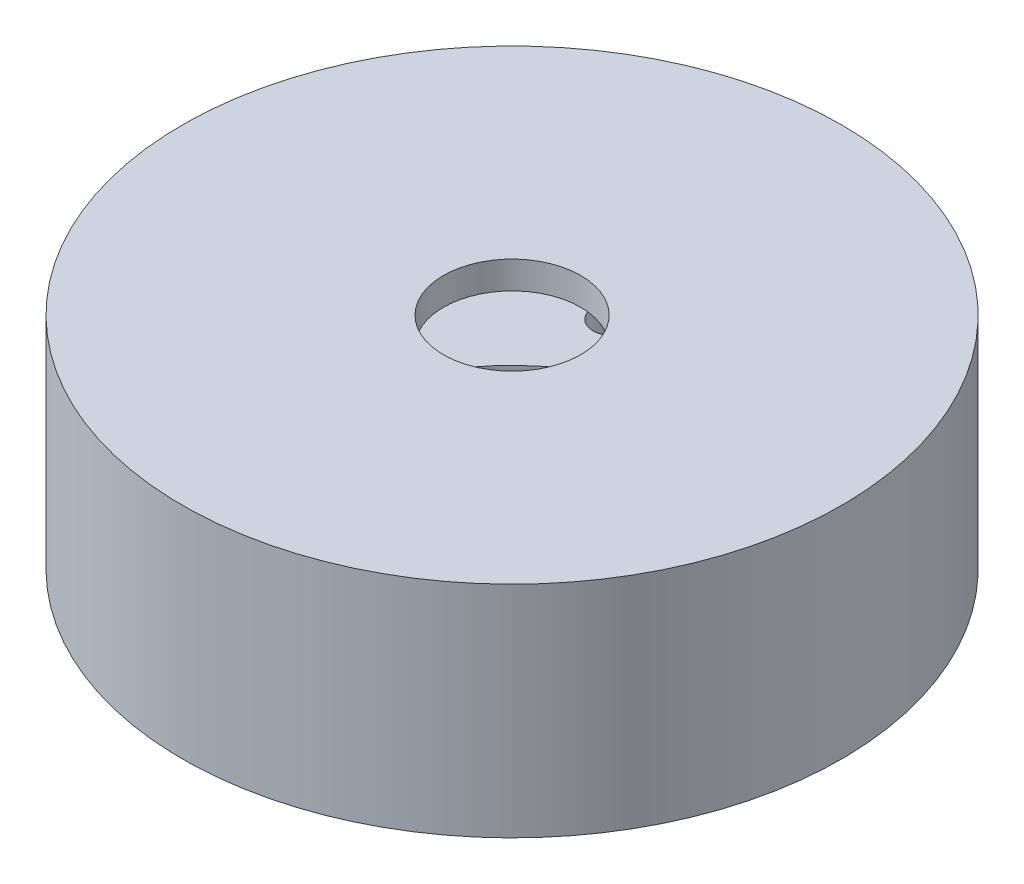
ISO-10303-21;
HEADER;
FILE_DESCRIPTION(('STEP AP214'),'2;1');
FILE_NAME('part.step','',(''),(''),'','','');
FILE_SCHEMA(('AUTOMOTIVE_DESIGN { 1 0 10303 214 1 1 1 1 }'));
ENDSEC;
DATA;
#1=APPLICATION_CONTEXT('core data for automotive mechanical design processes');
#2=APPLICATION_PROTOCOL_DEFINITION('international standard','automotive_design',2000,#1);
#3=PRODUCT_CONTEXT('',#1,'mechanical');
#4=PRODUCT('Part','Part','',(#3));
#5=PRODUCT_RELATED_PRODUCT_CATEGORY('part','',(#4));
#6=PRODUCT_DEFINITION_FORMATION('','',#4);
#7=PRODUCT_DEFINITION_CONTEXT('part definition',#1,'design');
#8=PRODUCT_DEFINITION('design','',#6,#7);
#9=PRODUCT_DEFINITION_SHAPE('','',#8);
#10=(LENGTH_UNIT() NAMED_UNIT(*) SI_UNIT(.MILLI.,.METRE.));
#11=(NAMED_UNIT(*) PLANE_ANGLE_UNIT() SI_UNIT($,.RADIAN.));
#12=(NAMED_UNIT(*) SI_UNIT($,.STERADIAN.) SOLID_ANGLE_UNIT());
#13=UNCERTAINTY_MEASURE_WITH_UNIT(LENGTH_MEASURE(1.E-05),#10,'distance_accuracy_value','');
#14=(GEOMETRIC_REPRESENTATION_CONTEXT(3) GLOBAL_UNCERTAINTY_ASSIGNED_CONTEXT((#13)) GLOBAL_UNIT_ASSIGNED_CONTEXT((#10,
#11,#12)) REPRESENTATION_CONTEXT('',''));
#15=CARTESIAN_POINT('',(0.,0.,0.));
#16=DIRECTION('',(0.,0.,1.));
#17=DIRECTION('',(1.,0.,0.));
#18=AXIS2_PLACEMENT_3D('',#15,#16,#17);
#19=CARTESIAN_POINT('',(-139.7,12.7,0.));
#20=DIRECTION('',(0.,1.,0.));
#21=DIRECTION('',(0.,0.,1.));
#22=AXIS2_PLACEMENT_3D('',#19,#20,#21);
#23=PLANE('',#22);
#24=CARTESIAN_POINT('',(0.,12.7,0.));
#25=DIRECTION('',(0.,-1.,0.));
#26=DIRECTION('',(0.,0.,-1.));
#27=AXIS2_PLACEMENT_3D('',#24,#25,#26);
#28=CIRCLE('',#27,139.7);
#29=CARTESIAN_POINT('',(0.,12.7,-139.7));
#30=VERTEX_POINT('',#29);
#31=EDGE_CURVE('E36',#30,#30,#28,.T.);
#32=ORIENTED_EDGE('',*,*,#31,.F.);
#33=EDGE_LOOP('',(#32));
#34=FACE_BOUND('',#33,.T.);
#35=CARTESIAN_POINT('',(127.67505097969,12.7,0.));
#36=DIRECTION('',(0.,1.,0.));
#37=DIRECTION('',(0.,0.,1.));
#38=AXIS2_PLACEMENT_3D('',#35,#36,#37);
#39=CIRCLE('',#38,9.26720301595461);
#40=CARTESIAN_POINT('',(127.67505097969,12.7,9.26720301595461));
#41=VERTEX_POINT('',#40);
#42=EDGE_CURVE('E60',#41,#41,#39,.F.);
#43=ORIENTED_EDGE('',*,*,#42,.T.);
#44=EDGE_LOOP('',(#43));
#45=FACE_BOUND('',#44,.T.);
#46=CARTESIAN_POINT('',(63.8375254898446,12.7,-110.569837577885));
#47=DIRECTION('',(0.,1.,0.));
#48=DIRECTION('',(0.,0.,1.));
#49=AXIS2_PLACEMENT_3D('',#46,#47,#48);
#50=CIRCLE('',#49,9.26720301595461);
#51=CARTESIAN_POINT('',(63.8375254898446,12.7,-101.30263456193));
#52=VERTEX_POINT('',#51);
#53=EDGE_CURVE('E90',#52,#52,#50,.F.);
#54=ORIENTED_EDGE('',*,*,#53,.T.);
#55=EDGE_LOOP('',(#54));
#56=FACE_BOUND('',#55,.T.);
#57=CARTESIAN_POINT('',(-63.8375254898454,12.7,-110.569837577884));
#58=DIRECTION('',(0.,1.,0.));
#59=DIRECTION('',(0.,0.,1.));
#60=AXIS2_PLACEMENT_3D('',#57,#58,#59);
#61=CIRCLE('',#60,9.26720301595462);
#62=CARTESIAN_POINT('',(-63.8375254898454,12.7,-101.30263456193));
#63=VERTEX_POINT('',#62);
#64=EDGE_CURVE('E84',#63,#63,#61,.F.);
#65=ORIENTED_EDGE('',*,*,#64,.T.);
#66=EDGE_LOOP('',(#65));
#67=FACE_BOUND('',#66,.T.);
#68=CARTESIAN_POINT('',(-127.67505097969,12.7,8.91550115862865E-13));
#69=DIRECTION('',(0.,1.,0.));
#70=DIRECTION('',(0.,0.,1.));
#71=AXIS2_PLACEMENT_3D('',#68,#69,#70);
#72=CIRCLE('',#71,9.26720301595462);
#73=CARTESIAN_POINT('',(-127.67505097969,12.7,9.26720301595551));
#74=VERTEX_POINT('',#73);
#75=EDGE_CURVE('E78',#74,#74,#72,.F.);
#76=ORIENTED_EDGE('',*,*,#75,.T.);
#77=EDGE_LOOP('',(#76));
#78=FACE_BOUND('',#77,.T.);
#79=CARTESIAN_POINT('',(-63.8375254898439,12.7,110.569837577885));
#80=DIRECTION('',(0.,1.,0.));
#81=DIRECTION('',(0.,0.,1.));
#82=AXIS2_PLACEMENT_3D('',#79,#80,#81);
#83=CIRCLE('',#82,9.26720301595461);
#84=CARTESIAN_POINT('',(-63.8375254898439,12.7,119.83704059384));
#85=VERTEX_POINT('',#84);
#86=EDGE_CURVE('E72',#85,#85,#83,.F.);
#87=ORIENTED_EDGE('',*,*,#86,.T.);
#88=EDGE_LOOP('',(#87));
#89=FACE_BOUND('',#88,.T.);
#90=CARTESIAN_POINT('',(63.8375254898462,12.7,110.569837577884));
#91=DIRECTION('',(0.,1.,0.));
#92=DIRECTION('',(0.,0.,1.));
#93=AXIS2_PLACEMENT_3D('',#90,#91,#92);
#94=CIRCLE('',#93,9.26720301595461);
#95=CARTESIAN_POINT('',(63.8375254898462,12.7,119.837040593839));
#96=VERTEX_POINT('',#95);
#97=EDGE_CURVE('E66',#96,#96,#94,.F.);
#98=ORIENTED_EDGE('',*,*,#97,.T.);
#99=EDGE_LOOP('',(#98));
#100=FACE_BOUND('',#99,.T.);
#101=CARTESIAN_POINT('',(0.,12.7,0.));
#102=DIRECTION('',(0.,1.,0.));
#103=DIRECTION('',(0.,0.,1.));
#104=AXIS2_PLACEMENT_3D('',#101,#102,#103);
#105=CIRCLE('',#104,97.2481137465327);
#106=CARTESIAN_POINT('',(0.,12.7,97.2481137465327));
#107=VERTEX_POINT('',#106);
#108=EDGE_CURVE('E57',#107,#107,#105,.F.);
#109=ORIENTED_EDGE('',*,*,#108,.T.);
#110=EDGE_LOOP('',(#109));
#111=FACE_BOUND('',#110,.T.);
#112=ADVANCED_FACE('F33',(#34,#45,#56,#67,#78,#89,#100,#111),#23,.T.);
#113=CARTESIAN_POINT('',(0.,50.8,0.));
#114=DIRECTION('',(0.,-1.,0.));
#115=DIRECTION('',(0.,0.,-1.));
#116=AXIS2_PLACEMENT_3D('',#113,#114,#115);
#117=CYLINDRICAL_SURFACE('',#116,152.4);
#118=CARTESIAN_POINT('',(0.,101.6,0.));
#119=DIRECTION('',(0.,-1.,0.));
#120=DIRECTION('',(0.,0.,-1.));
#121=AXIS2_PLACEMENT_3D('',#118,#119,#120);
#122=CIRCLE('',#121,152.4);
#123=CARTESIAN_POINT('',(0.,101.6,-152.4));
#124=VERTEX_POINT('',#123);
#125=EDGE_CURVE('E48',#124,#124,#122,.T.);
#126=ORIENTED_EDGE('',*,*,#125,.T.);
#127=EDGE_LOOP('',(#126));
#128=FACE_BOUND('',#127,.T.);
#129=CARTESIAN_POINT('',(0.,0.,0.));
#130=DIRECTION('',(0.,-1.,0.));
#131=DIRECTION('',(0.,0.,-1.));
#132=AXIS2_PLACEMENT_3D('',#129,#130,#131);
#133=CIRCLE('',#132,152.4);
#134=CARTESIAN_POINT('',(0.,0.,-152.4));
#135=VERTEX_POINT('',#134);
#136=EDGE_CURVE('E43',#135,#135,#133,.T.);
#137=ORIENTED_EDGE('',*,*,#136,.F.);
#138=EDGE_LOOP('',(#137));
#139=FACE_BOUND('',#138,.T.);
#140=ADVANCED_FACE('F120',(#128,#139),#117,.T.);
#141=CARTESIAN_POINT('',(0.,101.6,0.));
#142=DIRECTION('',(0.,-1.,0.));
#143=DIRECTION('',(0.,0.,-1.));
#144=AXIS2_PLACEMENT_3D('',#141,#142,#143);
#145=PLANE('',#144);
#146=ORIENTED_EDGE('',*,*,#125,.F.);
#147=EDGE_LOOP('',(#146));
#148=FACE_BOUND('',#147,.T.);
#149=CARTESIAN_POINT('',(0.,101.6,0.));
#150=DIRECTION('',(0.,-1.,0.));
#151=DIRECTION('',(0.,0.,-1.));
#152=AXIS2_PLACEMENT_3D('',#149,#150,#151);
#153=CIRCLE('',#152,31.75);
#154=CARTESIAN_POINT('',(0.,101.6,-31.75));
#155=VERTEX_POINT('',#154);
#156=EDGE_CURVE('E45',#155,#155,#153,.T.);
#157=ORIENTED_EDGE('',*,*,#156,.T.);
#158=EDGE_LOOP('',(#157));
#159=FACE_BOUND('',#158,.T.);
#160=ADVANCED_FACE('F113',(#148,#159),#145,.F.);
#161=CARTESIAN_POINT('',(0.,0.,0.));
#162=DIRECTION('',(0.,-1.,0.));
#163=DIRECTION('',(0.,0.,-1.));
#164=AXIS2_PLACEMENT_3D('',#161,#162,#163);
#165=PLANE('',#164);
#166=CARTESIAN_POINT('',(63.8375254898462,0.,110.569837577884));
#167=DIRECTION('',(0.,-1.,0.));
#168=DIRECTION('',(0.,0.,-1.));
#169=AXIS2_PLACEMENT_3D('',#166,#167,#168);
#170=CIRCLE('',#169,9.26720301595461);
#171=CARTESIAN_POINT('',(63.8375254898462,0.,101.302634561929));
#172=VERTEX_POINT('',#171);
#173=EDGE_CURVE('E63',#172,#172,#170,.T.);
#174=ORIENTED_EDGE('',*,*,#173,.F.);
#175=EDGE_LOOP('',(#174));
#176=FACE_BOUND('',#175,.T.);
#177=CARTESIAN_POINT('',(-63.8375254898439,0.,110.569837577885));
#178=DIRECTION('',(0.,-1.,0.));
#179=DIRECTION('',(0.,0.,-1.));
#180=AXIS2_PLACEMENT_3D('',#177,#178,#179);
#181=CIRCLE('',#180,9.26720301595461);
#182=CARTESIAN_POINT('',(-63.8375254898439,0.,101.302634561931));
#183=VERTEX_POINT('',#182);
#184=EDGE_CURVE('E69',#183,#183,#181,.T.);
#185=ORIENTED_EDGE('',*,*,#184,.F.);
#186=EDGE_LOOP('',(#185));
#187=FACE_BOUND('',#186,.T.);
#188=CARTESIAN_POINT('',(-127.67505097969,0.,8.91550115862865E-13));
#189=DIRECTION('',(0.,-1.,0.));
#190=DIRECTION('',(0.,0.,-1.));
#191=AXIS2_PLACEMENT_3D('',#188,#189,#190);
#192=CIRCLE('',#191,9.26720301595462);
#193=CARTESIAN_POINT('',(-127.67505097969,0.,-9.26720301595373));
#194=VERTEX_POINT('',#193);
#195=EDGE_CURVE('E75',#194,#194,#192,.T.);
#196=ORIENTED_EDGE('',*,*,#195,.F.);
#197=EDGE_LOOP('',(#196));
#198=FACE_BOUND('',#197,.T.);
#199=CARTESIAN_POINT('',(-63.8375254898454,0.,-110.569837577884));
#200=DIRECTION('',(0.,-1.,0.));
#201=DIRECTION('',(0.,0.,-1.));
#202=AXIS2_PLACEMENT_3D('',#199,#200,#201);
#203=CIRCLE('',#202,9.26720301595462);
#204=CARTESIAN_POINT('',(-63.8375254898454,0.,-119.837040593839));
#205=VERTEX_POINT('',#204);
#206=EDGE_CURVE('E81',#205,#205,#203,.T.);
#207=ORIENTED_EDGE('',*,*,#206,.F.);
#208=EDGE_LOOP('',(#207));
#209=FACE_BOUND('',#208,.T.);
#210=CARTESIAN_POINT('',(63.8375254898446,0.,-110.569837577885));
#211=DIRECTION('',(0.,-1.,0.));
#212=DIRECTION('',(0.,0.,-1.));
#213=AXIS2_PLACEMENT_3D('',#210,#211,#212);
#214=CIRCLE('',#213,9.26720301595461);
#215=CARTESIAN_POINT('',(63.8375254898446,0.,-119.837040593839));
#216=VERTEX_POINT('',#215);
#217=EDGE_CURVE('E87',#216,#216,#214,.T.);
#218=ORIENTED_EDGE('',*,*,#217,.F.);
#219=EDGE_LOOP('',(#218));
#220=FACE_BOUND('',#219,.T.);
#221=CARTESIAN_POINT('',(127.67505097969,0.,0.));
#222=DIRECTION('',(0.,-1.,0.));
#223=DIRECTION('',(0.,0.,-1.));
#224=AXIS2_PLACEMENT_3D('',#221,#222,#223);
#225=CIRCLE('',#224,9.26720301595461);
#226=CARTESIAN_POINT('',(127.67505097969,0.,-9.26720301595461));
#227=VERTEX_POINT('',#226);
#228=EDGE_CURVE('E93',#227,#227,#225,.T.);
#229=ORIENTED_EDGE('',*,*,#228,.F.);
#230=EDGE_LOOP('',(#229));
#231=FACE_BOUND('',#230,.T.);
#232=CARTESIAN_POINT('',(0.,0.,0.));
#233=DIRECTION('',(0.,-1.,0.));
#234=DIRECTION('',(0.,0.,-1.));
#235=AXIS2_PLACEMENT_3D('',#232,#233,#234);
#236=CIRCLE('',#235,97.2481137465327);
#237=CARTESIAN_POINT('',(0.,0.,-97.2481137465327));
#238=VERTEX_POINT('',#237);
#239=EDGE_CURVE('E52',#238,#238,#236,.T.);
#240=ORIENTED_EDGE('',*,*,#239,.F.);
#241=EDGE_LOOP('',(#240));
#242=FACE_BOUND('',#241,.T.);
#243=ORIENTED_EDGE('',*,*,#136,.T.);
#244=EDGE_LOOP('',(#243));
#245=FACE_BOUND('',#244,.T.);
#246=ADVANCED_FACE('F110',(#176,#187,#198,#209,#220,#231,#242,#245),#165,.T.);
#247=CARTESIAN_POINT('',(0.,50.8,0.));
#248=DIRECTION('',(0.,-1.,0.));
#249=DIRECTION('',(0.,0.,-1.));
#250=AXIS2_PLACEMENT_3D('',#247,#248,#249);
#251=CYLINDRICAL_SURFACE('',#250,139.7);
#252=ORIENTED_EDGE('',*,*,#31,.T.);
#253=EDGE_LOOP('',(#252));
#254=FACE_BOUND('',#253,.T.);
#255=CARTESIAN_POINT('',(0.,88.8553957976228,0.));
#256=DIRECTION('',(0.,-1.,0.));
#257=DIRECTION('',(0.,0.,-1.));
#258=AXIS2_PLACEMENT_3D('',#255,#256,#257);
#259=CIRCLE('',#258,139.7);
#260=CARTESIAN_POINT('',(0.,88.8553957976228,-139.7));
#261=VERTEX_POINT('',#260);
#262=EDGE_CURVE('E10',#261,#261,#259,.T.);
#263=ORIENTED_EDGE('',*,*,#262,.F.);
#264=EDGE_LOOP('',(#263));
#265=FACE_BOUND('',#264,.T.);
#266=ADVANCED_FACE('F107',(#254,#265),#251,.F.);
#267=CARTESIAN_POINT('',(0.,50.8,0.));
#268=DIRECTION('',(0.,-1.,0.));
#269=DIRECTION('',(0.,0.,-1.));
#270=AXIS2_PLACEMENT_3D('',#267,#268,#269);
#271=CYLINDRICAL_SURFACE('',#270,31.75);
#272=CARTESIAN_POINT('',(0.,88.8553957976228,0.));
#273=DIRECTION('',(0.,-1.,0.));
#274=DIRECTION('',(0.,0.,-1.));
#275=AXIS2_PLACEMENT_3D('',#272,#273,#274);
#276=CIRCLE('',#275,31.75);
#277=CARTESIAN_POINT('',(0.,88.8553957976228,-31.75));
#278=VERTEX_POINT('',#277);
#279=EDGE_CURVE('E49',#278,#278,#276,.T.);
#280=ORIENTED_EDGE('',*,*,#279,.T.);
#281=EDGE_LOOP('',(#280));
#282=FACE_BOUND('',#281,.T.);
#283=ORIENTED_EDGE('',*,*,#156,.F.);
#284=EDGE_LOOP('',(#283));
#285=FACE_BOUND('',#284,.T.);
#286=ADVANCED_FACE('F133',(#282,#285),#271,.F.);
#287=CARTESIAN_POINT('',(-139.7,88.8553957976228,0.));
#288=DIRECTION('',(0.,1.,0.));
#289=DIRECTION('',(0.,0.,1.));
#290=AXIS2_PLACEMENT_3D('',#287,#288,#289);
#291=PLANE('',#290);
#292=ORIENTED_EDGE('',*,*,#279,.F.);
#293=EDGE_LOOP('',(#292));
#294=FACE_BOUND('',#293,.T.);
#295=ORIENTED_EDGE('',*,*,#262,.T.);
#296=EDGE_LOOP('',(#295));
#297=FACE_BOUND('',#296,.T.);
#298=ADVANCED_FACE('F105',(#294,#297),#291,.F.);
#299=CARTESIAN_POINT('',(127.67505097969,101.601,0.));
#300=DIRECTION('',(0.,-1.,0.));
#301=DIRECTION('',(0.,0.,-1.));
#302=AXIS2_PLACEMENT_3D('',#299,#300,#301);
#303=CYLINDRICAL_SURFACE('',#302,9.26720301595461);
#304=ORIENTED_EDGE('',*,*,#42,.F.);
#305=EDGE_LOOP('',(#304));
#306=FACE_BOUND('',#305,.T.);
#307=ORIENTED_EDGE('',*,*,#228,.T.);
#308=EDGE_LOOP('',(#307));
#309=FACE_BOUND('',#308,.T.);
#310=ADVANCED_FACE('F101',(#306,#309),#303,.F.);
#311=CARTESIAN_POINT('',(63.8375254898446,101.601,-110.569837577885));
#312=DIRECTION('',(0.,-1.,0.));
#313=DIRECTION('',(0.,0.,-1.));
#314=AXIS2_PLACEMENT_3D('',#311,#312,#313);
#315=CYLINDRICAL_SURFACE('',#314,9.26720301595461);
#316=ORIENTED_EDGE('',*,*,#53,.F.);
#317=EDGE_LOOP('',(#316));
#318=FACE_BOUND('',#317,.T.);
#319=ORIENTED_EDGE('',*,*,#217,.T.);
#320=EDGE_LOOP('',(#319));
#321=FACE_BOUND('',#320,.T.);
#322=ADVANCED_FACE('F104',(#318,#321),#315,.F.);
#323=CARTESIAN_POINT('',(-63.8375254898454,101.601,-110.569837577884));
#324=DIRECTION('',(0.,-1.,0.));
#325=DIRECTION('',(0.,0.,-1.));
#326=AXIS2_PLACEMENT_3D('',#323,#324,#325);
#327=CYLINDRICAL_SURFACE('',#326,9.26720301595462);
#328=ORIENTED_EDGE('',*,*,#64,.F.);
#329=EDGE_LOOP('',(#328));
#330=FACE_BOUND('',#329,.T.);
#331=ORIENTED_EDGE('',*,*,#206,.T.);
#332=EDGE_LOOP('',(#331));
#333=FACE_BOUND('',#332,.T.);
#334=ADVANCED_FACE('F159',(#330,#333),#327,.F.);
#335=CARTESIAN_POINT('',(-127.67505097969,101.601,8.91550115862865E-13));
#336=DIRECTION('',(0.,-1.,0.));
#337=DIRECTION('',(0.,0.,-1.));
#338=AXIS2_PLACEMENT_3D('',#335,#336,#337);
#339=CYLINDRICAL_SURFACE('',#338,9.26720301595462);
#340=ORIENTED_EDGE('',*,*,#75,.F.);
#341=EDGE_LOOP('',(#340));
#342=FACE_BOUND('',#341,.T.);
#343=ORIENTED_EDGE('',*,*,#195,.T.);
#344=EDGE_LOOP('',(#343));
#345=FACE_BOUND('',#344,.T.);
#346=ADVANCED_FACE('F167',(#342,#345),#339,.F.);
#347=CARTESIAN_POINT('',(-63.8375254898439,101.601,110.569837577885));
#348=DIRECTION('',(0.,-1.,0.));
#349=DIRECTION('',(0.,0.,-1.));
#350=AXIS2_PLACEMENT_3D('',#347,#348,#349);
#351=CYLINDRICAL_SURFACE('',#350,9.26720301595461);
#352=ORIENTED_EDGE('',*,*,#86,.F.);
#353=EDGE_LOOP('',(#352));
#354=FACE_BOUND('',#353,.T.);
#355=ORIENTED_EDGE('',*,*,#184,.T.);
#356=EDGE_LOOP('',(#355));
#357=FACE_BOUND('',#356,.T.);
#358=ADVANCED_FACE('F175',(#354,#357),#351,.F.);
#359=CARTESIAN_POINT('',(63.8375254898462,101.601,110.569837577884));
#360=DIRECTION('',(0.,-1.,0.));
#361=DIRECTION('',(0.,0.,-1.));
#362=AXIS2_PLACEMENT_3D('',#359,#360,#361);
#363=CYLINDRICAL_SURFACE('',#362,9.26720301595461);
#364=ORIENTED_EDGE('',*,*,#97,.F.);
#365=EDGE_LOOP('',(#364));
#366=FACE_BOUND('',#365,.T.);
#367=ORIENTED_EDGE('',*,*,#173,.T.);
#368=EDGE_LOOP('',(#367));
#369=FACE_BOUND('',#368,.T.);
#370=ADVANCED_FACE('F183',(#366,#369),#363,.F.);
#371=CARTESIAN_POINT('',(0.,101.601,0.));
#372=DIRECTION('',(0.,-1.,0.));
#373=DIRECTION('',(0.,0.,-1.));
#374=AXIS2_PLACEMENT_3D('',#371,#372,#373);
#375=CYLINDRICAL_SURFACE('',#374,97.2481137465327);
#376=ORIENTED_EDGE('',*,*,#108,.F.);
#377=EDGE_LOOP('',(#376));
#378=FACE_BOUND('',#377,.T.);
#379=ORIENTED_EDGE('',*,*,#239,.T.);
#380=EDGE_LOOP('',(#379));
#381=FACE_BOUND('',#380,.T.);
#382=ADVANCED_FACE('F191',(#378,#381),#375,.F.);
#383=CLOSED_SHELL('',(#112,#140,#160,#246,#266,#286,#298,#310,#322,#334,#346,#358,#370,#382));
#384=MANIFOLD_SOLID_BREP('B2',#383);
#385=ADVANCED_BREP_SHAPE_REPRESENTATION('',(#18,#384),#14);
#386=SHAPE_DEFINITION_REPRESENTATION(#9,#385);
ENDSEC;
END-ISO-10303-21;
